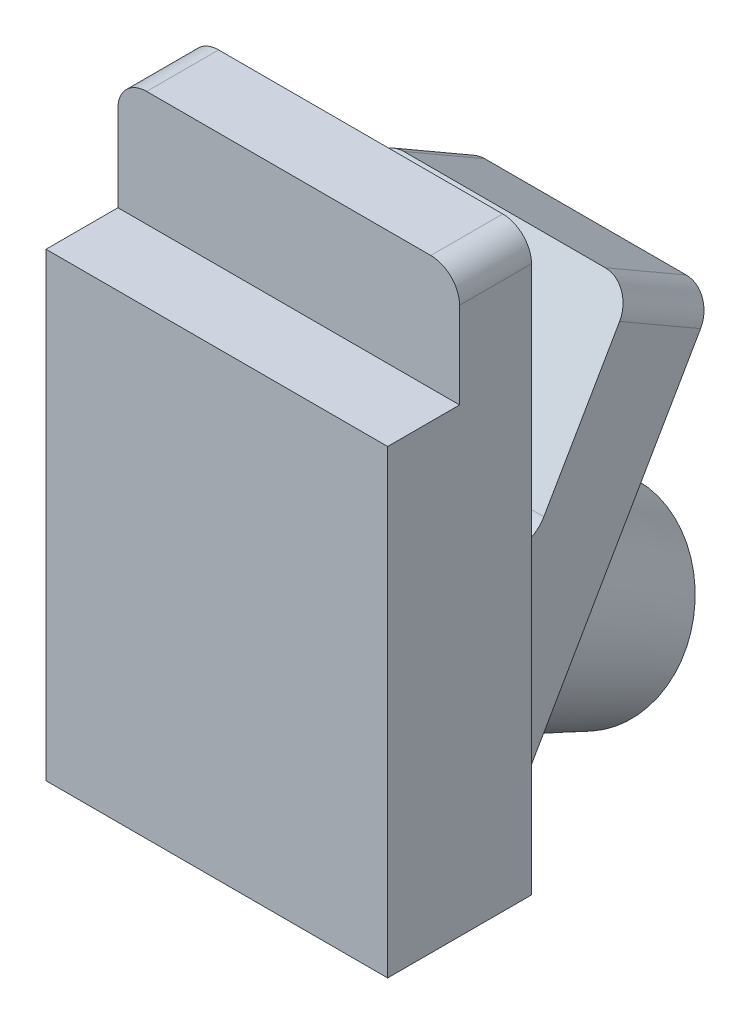
ISO-10303-21;
HEADER;
FILE_DESCRIPTION(('STEP AP214'),'2;1');
FILE_NAME('part.step','',(''),(''),'','','');
FILE_SCHEMA(('AUTOMOTIVE_DESIGN { 1 0 10303 214 1 1 1 1 }'));
ENDSEC;
DATA;
#1=APPLICATION_CONTEXT('core data for automotive mechanical design processes');
#2=APPLICATION_PROTOCOL_DEFINITION('international standard','automotive_design',2000,#1);
#3=PRODUCT_CONTEXT('',#1,'mechanical');
#4=PRODUCT('Part','Part','',(#3));
#5=PRODUCT_RELATED_PRODUCT_CATEGORY('part','',(#4));
#6=PRODUCT_DEFINITION_FORMATION('','',#4);
#7=PRODUCT_DEFINITION_CONTEXT('part definition',#1,'design');
#8=PRODUCT_DEFINITION('design','',#6,#7);
#9=PRODUCT_DEFINITION_SHAPE('','',#8);
#10=(LENGTH_UNIT() NAMED_UNIT(*) SI_UNIT(.MILLI.,.METRE.));
#11=(NAMED_UNIT(*) PLANE_ANGLE_UNIT() SI_UNIT($,.RADIAN.));
#12=(NAMED_UNIT(*) SI_UNIT($,.STERADIAN.) SOLID_ANGLE_UNIT());
#13=UNCERTAINTY_MEASURE_WITH_UNIT(LENGTH_MEASURE(1.E-05),#10,'distance_accuracy_value','');
#14=(GEOMETRIC_REPRESENTATION_CONTEXT(3) GLOBAL_UNCERTAINTY_ASSIGNED_CONTEXT((#13)) GLOBAL_UNIT_ASSIGNED_CONTEXT((#10,
#11,#12)) REPRESENTATION_CONTEXT('',''));
#15=CARTESIAN_POINT('',(0.,0.,0.));
#16=DIRECTION('',(0.,0.,1.));
#17=DIRECTION('',(1.,0.,0.));
#18=AXIS2_PLACEMENT_3D('',#15,#16,#17);
#19=CARTESIAN_POINT('',(-9.,-36.7355485659508,7.16782696905291));
#20=DIRECTION('',(0.,-0.500000000000001,-0.866025403784438));
#21=DIRECTION('',(0.,0.866025403784438,-0.500000000000001));
#22=AXIS2_PLACEMENT_3D('',#19,#20,#21);
#23=PLANE('',#22);
#24=DIRECTION('',(0.,0.866025403784438,-0.500000000000001));
#25=VECTOR('',#24,1.);
#26=CARTESIAN_POINT('',(-9.,-36.7355485659508,7.16782696905291));
#27=LINE('',#26,#25);
#28=CARTESIAN_POINT('',(-9.,-0.535898384862295,-13.7320508075689));
#29=VERTEX_POINT('',#28);
#30=CARTESIAN_POINT('',(-9.,8.59078332763969,-19.0013429510899));
#31=VERTEX_POINT('',#30);
#32=EDGE_CURVE('E242',#29,#31,#27,.T.);
#33=ORIENTED_EDGE('',*,*,#32,.F.);
#34=DIRECTION('',(1.,0.,0.));
#35=VECTOR('',#34,1.);
#36=CARTESIAN_POINT('',(-9.,-0.535898384862295,-13.7320508075689));
#37=LINE('',#36,#35);
#38=CARTESIAN_POINT('',(9.,-0.535898384862295,-13.7320508075689));
#39=VERTEX_POINT('',#38);
#40=EDGE_CURVE('E219',#29,#39,#37,.T.);
#41=ORIENTED_EDGE('',*,*,#40,.T.);
#42=DIRECTION('',(0.,0.866025403784438,-0.500000000000001));
#43=VECTOR('',#42,1.);
#44=CARTESIAN_POINT('',(9.,-36.7355485659508,7.16782696905291));
#45=LINE('',#44,#43);
#46=CARTESIAN_POINT('',(9.,8.59078332763969,-19.0013429510899));
#47=VERTEX_POINT('',#46);
#48=EDGE_CURVE('E251',#39,#47,#45,.T.);
#49=ORIENTED_EDGE('',*,*,#48,.T.);
#50=CARTESIAN_POINT('',(7.,8.59078332763969,-19.0013429510899));
#51=DIRECTION('',(0.,-0.500000000000001,-0.866025403784438));
#52=DIRECTION('',(0.,0.866025403784438,-0.500000000000001));
#53=AXIS2_PLACEMENT_3D('',#50,#51,#52);
#54=CIRCLE('',#53,2.);
#55=CARTESIAN_POINT('',(7.,10.3228341352086,-20.0013429510899));
#56=VERTEX_POINT('',#55);
#57=EDGE_CURVE('E217',#47,#56,#54,.F.);
#58=ORIENTED_EDGE('',*,*,#57,.T.);
#59=DIRECTION('',(1.,0.,0.));
#60=VECTOR('',#59,1.);
#61=CARTESIAN_POINT('',(-9.,10.3228341352086,-20.0013429510899));
#62=LINE('',#61,#60);
#63=CARTESIAN_POINT('',(-7.,10.3228341352086,-20.0013429510899));
#64=VERTEX_POINT('',#63);
#65=EDGE_CURVE('E252',#64,#56,#62,.T.);
#66=ORIENTED_EDGE('',*,*,#65,.F.);
#67=CARTESIAN_POINT('',(-7.,8.59078332763969,-19.0013429510899));
#68=DIRECTION('',(0.,-0.500000000000001,-0.866025403784438));
#69=DIRECTION('',(0.,0.866025403784438,-0.500000000000001));
#70=AXIS2_PLACEMENT_3D('',#67,#68,#69);
#71=CIRCLE('',#70,2.);
#72=EDGE_CURVE('E215',#64,#31,#71,.F.);
#73=ORIENTED_EDGE('',*,*,#72,.T.);
#74=EDGE_LOOP('',(#33,#41,#49,#58,#66,#73));
#75=FACE_BOUND('',#74,.T.);
#76=ADVANCED_FACE('F34',(#75),#23,.F.);
#77=CARTESIAN_POINT('',(9.,-39.9855485659508,1.53866184445407));
#78=DIRECTION('',(-1.,0.,0.));
#79=DIRECTION('',(0.,0.,1.));
#80=AXIS2_PLACEMENT_3D('',#77,#78,#79);
#81=PLANE('',#80);
#82=DIRECTION('',(0.,0.866025403784438,-0.500000000000001));
#83=VECTOR('',#82,1.);
#84=CARTESIAN_POINT('',(9.,-39.9855485659508,1.53866184445407));
#85=LINE('',#84,#83);
#86=CARTESIAN_POINT('',(9.,-20.,-10.));
#87=VERTEX_POINT('',#86);
#88=CARTESIAN_POINT('',(9.,5.34078332763968,-24.6305080756888));
#89=VERTEX_POINT('',#88);
#90=EDGE_CURVE('E261',#87,#89,#85,.T.);
#91=ORIENTED_EDGE('',*,*,#90,.T.);
#92=DIRECTION('',(0.,-0.500000000000001,-0.866025403784438));
#93=VECTOR('',#92,1.);
#94=CARTESIAN_POINT('',(9.,8.59078332763969,-19.0013429510899));
#95=LINE('',#94,#93);
#96=EDGE_CURVE('E234',#89,#47,#95,.F.);
#97=ORIENTED_EDGE('',*,*,#96,.T.);
#98=ORIENTED_EDGE('',*,*,#48,.F.);
#99=CARTESIAN_POINT('',(9.,0.464101615137706,-12.));
#100=DIRECTION('',(-1.,0.,0.));
#101=DIRECTION('',(0.,0.,1.));
#102=AXIS2_PLACEMENT_3D('',#99,#100,#101);
#103=CIRCLE('',#102,2.);
#104=CARTESIAN_POINT('',(9.,0.464101615137706,-10.));
#105=VERTEX_POINT('',#104);
#106=EDGE_CURVE('E237',#39,#105,#103,.T.);
#107=ORIENTED_EDGE('',*,*,#106,.T.);
#108=DIRECTION('',(0.,-1.,0.));
#109=VECTOR('',#108,1.);
#110=CARTESIAN_POINT('',(8.99999999999999,-39.9855485659508,-10.));
#111=LINE('',#110,#109);
#112=EDGE_CURVE('E258',#105,#87,#111,.T.);
#113=ORIENTED_EDGE('',*,*,#112,.T.);
#114=EDGE_LOOP('',(#91,#97,#98,#107,#113));
#115=FACE_BOUND('',#114,.T.);
#116=ADVANCED_FACE('F257',(#115),#81,.F.);
#117=CARTESIAN_POINT('',(-9.,-39.9855485659508,1.53866184445407));
#118=DIRECTION('',(0.,0.500000000000001,0.866025403784438));
#119=DIRECTION('',(0.,-0.866025403784438,0.500000000000001));
#120=AXIS2_PLACEMENT_3D('',#117,#118,#119);
#121=PLANE('',#120);
#122=CARTESIAN_POINT('',(0.,-10.2139129372358,-15.65));
#123=DIRECTION('',(0.,0.500000000000001,0.866025403784438));
#124=DIRECTION('',(0.,-0.866025403784438,0.500000000000001));
#125=AXIS2_PLACEMENT_3D('',#122,#123,#124);
#126=CIRCLE('',#125,7.5);
#127=CARTESIAN_POINT('',(0.,-16.7091034656191,-11.9));
#128=VERTEX_POINT('',#127);
#129=EDGE_CURVE('E11',#128,#128,#126,.F.);
#130=ORIENTED_EDGE('',*,*,#129,.F.);
#131=EDGE_LOOP('',(#130));
#132=FACE_BOUND('',#131,.T.);
#133=DIRECTION('',(-1.,0.,0.));
#134=VECTOR('',#133,1.);
#135=CARTESIAN_POINT('',(9.,7.07283413520856,-25.6305080756888));
#136=LINE('',#135,#134);
#137=CARTESIAN_POINT('',(7.,7.07283413520856,-25.6305080756888));
#138=VERTEX_POINT('',#137);
#139=CARTESIAN_POINT('',(-7.,7.07283413520856,-25.6305080756888));
#140=VERTEX_POINT('',#139);
#141=EDGE_CURVE('E275',#138,#140,#136,.T.);
#142=ORIENTED_EDGE('',*,*,#141,.F.);
#143=CARTESIAN_POINT('',(7.,5.34078332763969,-24.6305080756888));
#144=DIRECTION('',(0.,0.500000000000001,0.866025403784438));
#145=DIRECTION('',(0.,-0.866025403784438,0.500000000000001));
#146=AXIS2_PLACEMENT_3D('',#143,#144,#145);
#147=CIRCLE('',#146,2.);
#148=EDGE_CURVE('E57',#138,#89,#147,.F.);
#149=ORIENTED_EDGE('',*,*,#148,.T.);
#150=ORIENTED_EDGE('',*,*,#90,.F.);
#151=DIRECTION('',(-1.,0.,0.));
#152=VECTOR('',#151,1.);
#153=CARTESIAN_POINT('',(-9.,-20.,-10.));
#154=LINE('',#153,#152);
#155=CARTESIAN_POINT('',(-9.,-20.,-10.));
#156=VERTEX_POINT('',#155);
#157=EDGE_CURVE('E268',#87,#156,#154,.T.);
#158=ORIENTED_EDGE('',*,*,#157,.T.);
#159=DIRECTION('',(0.,0.866025403784438,-0.500000000000001));
#160=VECTOR('',#159,1.);
#161=CARTESIAN_POINT('',(-9.,-39.9855485659508,1.53866184445407));
#162=LINE('',#161,#160);
#163=CARTESIAN_POINT('',(-9.,5.34078332763969,-24.6305080756888));
#164=VERTEX_POINT('',#163);
#165=EDGE_CURVE('E263',#156,#164,#162,.T.);
#166=ORIENTED_EDGE('',*,*,#165,.T.);
#167=CARTESIAN_POINT('',(-7.,5.34078332763969,-24.6305080756888));
#168=DIRECTION('',(0.,0.500000000000001,0.866025403784438));
#169=DIRECTION('',(0.,-0.866025403784438,0.500000000000001));
#170=AXIS2_PLACEMENT_3D('',#167,#168,#169);
#171=CIRCLE('',#170,2.);
#172=EDGE_CURVE('E231',#164,#140,#171,.F.);
#173=ORIENTED_EDGE('',*,*,#172,.T.);
#174=EDGE_LOOP('',(#142,#149,#150,#158,#166,#173));
#175=FACE_BOUND('',#174,.T.);
#176=ADVANCED_FACE('F308',(#132,#175),#121,.F.);
#177=CARTESIAN_POINT('',(-9.,-39.9855485659508,1.53866184445407));
#178=DIRECTION('',(1.,0.,0.));
#179=DIRECTION('',(0.,0.,-1.));
#180=AXIS2_PLACEMENT_3D('',#177,#178,#179);
#181=PLANE('',#180);
#182=ORIENTED_EDGE('',*,*,#32,.T.);
#183=DIRECTION('',(0.,0.500000000000001,0.866025403784438));
#184=VECTOR('',#183,1.);
#185=CARTESIAN_POINT('',(-9.,5.34078332763969,-24.6305080756888));
#186=LINE('',#185,#184);
#187=EDGE_CURVE('E49',#31,#164,#186,.F.);
#188=ORIENTED_EDGE('',*,*,#187,.T.);
#189=ORIENTED_EDGE('',*,*,#165,.F.);
#190=DIRECTION('',(0.,1.,0.));
#191=VECTOR('',#190,1.);
#192=CARTESIAN_POINT('',(-8.99999999999999,-39.9855485659508,-10.));
#193=LINE('',#192,#191);
#194=CARTESIAN_POINT('',(-9.,0.464101615137706,-10.));
#195=VERTEX_POINT('',#194);
#196=EDGE_CURVE('E243',#156,#195,#193,.T.);
#197=ORIENTED_EDGE('',*,*,#196,.T.);
#198=CARTESIAN_POINT('',(-9.,0.464101615137706,-12.));
#199=DIRECTION('',(1.,0.,0.));
#200=DIRECTION('',(0.,0.,-1.));
#201=AXIS2_PLACEMENT_3D('',#198,#199,#200);
#202=CIRCLE('',#201,2.);
#203=EDGE_CURVE('E42',#195,#29,#202,.T.);
#204=ORIENTED_EDGE('',*,*,#203,.T.);
#205=EDGE_LOOP('',(#182,#188,#189,#197,#204));
#206=FACE_BOUND('',#205,.T.);
#207=ADVANCED_FACE('F241',(#206),#181,.F.);
#208=CARTESIAN_POINT('',(11.875,20.,-10.));
#209=DIRECTION('',(0.,1.,0.));
#210=DIRECTION('',(0.,0.,1.));
#211=AXIS2_PLACEMENT_3D('',#208,#209,#210);
#212=PLANE('',#211);
#213=DIRECTION('',(-1.,0.,0.));
#214=VECTOR('',#213,1.);
#215=CARTESIAN_POINT('',(-11.875,20.,-5.));
#216=LINE('',#215,#214);
#217=CARTESIAN_POINT('',(9.875,20.,-5.));
#218=VERTEX_POINT('',#217);
#219=CARTESIAN_POINT('',(-9.875,20.,-5.));
#220=VERTEX_POINT('',#219);
#221=EDGE_CURVE('E169',#218,#220,#216,.T.);
#222=ORIENTED_EDGE('',*,*,#221,.F.);
#223=DIRECTION('',(0.,0.,1.));
#224=VECTOR('',#223,1.);
#225=CARTESIAN_POINT('',(9.875,20.,-10.));
#226=LINE('',#225,#224);
#227=CARTESIAN_POINT('',(9.875,20.,-10.));
#228=VERTEX_POINT('',#227);
#229=EDGE_CURVE('E207',#218,#228,#226,.F.);
#230=ORIENTED_EDGE('',*,*,#229,.T.);
#231=DIRECTION('',(-1.,0.,0.));
#232=VECTOR('',#231,1.);
#233=CARTESIAN_POINT('',(11.875,20.,-10.));
#234=LINE('',#233,#232);
#235=CARTESIAN_POINT('',(-9.875,20.,-10.));
#236=VERTEX_POINT('',#235);
#237=EDGE_CURVE('E185',#228,#236,#234,.T.);
#238=ORIENTED_EDGE('',*,*,#237,.T.);
#239=DIRECTION('',(0.,0.,1.));
#240=VECTOR('',#239,1.);
#241=CARTESIAN_POINT('',(-9.875,20.,-10.));
#242=LINE('',#241,#240);
#243=EDGE_CURVE('E204',#236,#220,#242,.T.);
#244=ORIENTED_EDGE('',*,*,#243,.T.);
#245=EDGE_LOOP('',(#222,#230,#238,#244));
#246=FACE_BOUND('',#245,.T.);
#247=ADVANCED_FACE('F319',(#246),#212,.T.);
#248=CARTESIAN_POINT('',(-11.875,20.,-10.));
#249=DIRECTION('',(-1.,0.,0.));
#250=DIRECTION('',(0.,-1.,0.));
#251=AXIS2_PLACEMENT_3D('',#248,#249,#250);
#252=PLANE('',#251);
#253=DIRECTION('',(0.,-1.,0.));
#254=VECTOR('',#253,1.);
#255=CARTESIAN_POINT('',(-11.875,20.,-5.));
#256=LINE('',#255,#254);
#257=CARTESIAN_POINT('',(-11.875,18.,-5.));
#258=VERTEX_POINT('',#257);
#259=CARTESIAN_POINT('',(-11.875,12.,-5.));
#260=VERTEX_POINT('',#259);
#261=EDGE_CURVE('E144',#258,#260,#256,.T.);
#262=ORIENTED_EDGE('',*,*,#261,.F.);
#263=DIRECTION('',(0.,0.,1.));
#264=VECTOR('',#263,1.);
#265=CARTESIAN_POINT('',(-11.875,18.,-10.));
#266=LINE('',#265,#264);
#267=CARTESIAN_POINT('',(-11.875,18.,-10.));
#268=VERTEX_POINT('',#267);
#269=EDGE_CURVE('E213',#258,#268,#266,.F.);
#270=ORIENTED_EDGE('',*,*,#269,.T.);
#271=DIRECTION('',(0.,-1.,0.));
#272=VECTOR('',#271,1.);
#273=CARTESIAN_POINT('',(-11.875,20.,-10.));
#274=LINE('',#273,#272);
#275=CARTESIAN_POINT('',(-11.875,-20.,-10.));
#276=VERTEX_POINT('',#275);
#277=EDGE_CURVE('E175',#268,#276,#274,.T.);
#278=ORIENTED_EDGE('',*,*,#277,.T.);
#279=DIRECTION('',(0.,0.,1.));
#280=VECTOR('',#279,1.);
#281=CARTESIAN_POINT('',(-11.875,-20.,-10.));
#282=LINE('',#281,#280);
#283=CARTESIAN_POINT('',(-11.875,-20.,0.));
#284=VERTEX_POINT('',#283);
#285=EDGE_CURVE('E188',#276,#284,#282,.T.);
#286=ORIENTED_EDGE('',*,*,#285,.T.);
#287=DIRECTION('',(0.,-1.,0.));
#288=VECTOR('',#287,1.);
#289=CARTESIAN_POINT('',(-11.875,20.,0.));
#290=LINE('',#289,#288);
#291=CARTESIAN_POINT('',(-11.875,12.,0.));
#292=VERTEX_POINT('',#291);
#293=EDGE_CURVE('E168',#292,#284,#290,.T.);
#294=ORIENTED_EDGE('',*,*,#293,.F.);
#295=DIRECTION('',(0.,0.,1.));
#296=VECTOR('',#295,1.);
#297=CARTESIAN_POINT('',(-11.875,12.,-5.));
#298=LINE('',#297,#296);
#299=EDGE_CURVE('E159',#260,#292,#298,.T.);
#300=ORIENTED_EDGE('',*,*,#299,.F.);
#301=EDGE_LOOP('',(#262,#270,#278,#286,#294,#300));
#302=FACE_BOUND('',#301,.T.);
#303=ADVANCED_FACE('F166',(#302),#252,.T.);
#304=CARTESIAN_POINT('',(11.875,20.,-10.));
#305=DIRECTION('',(1.,0.,0.));
#306=DIRECTION('',(0.,1.,0.));
#307=AXIS2_PLACEMENT_3D('',#304,#305,#306);
#308=PLANE('',#307);
#309=DIRECTION('',(0.,1.,0.));
#310=VECTOR('',#309,1.);
#311=CARTESIAN_POINT('',(11.875,20.,-10.));
#312=LINE('',#311,#310);
#313=CARTESIAN_POINT('',(11.875,-20.,-10.));
#314=VERTEX_POINT('',#313);
#315=CARTESIAN_POINT('',(11.875,18.,-10.));
#316=VERTEX_POINT('',#315);
#317=EDGE_CURVE('E182',#314,#316,#312,.T.);
#318=ORIENTED_EDGE('',*,*,#317,.T.);
#319=DIRECTION('',(0.,0.,1.));
#320=VECTOR('',#319,1.);
#321=CARTESIAN_POINT('',(11.875,18.,-10.));
#322=LINE('',#321,#320);
#323=CARTESIAN_POINT('',(11.875,18.,-5.));
#324=VERTEX_POINT('',#323);
#325=EDGE_CURVE('E197',#316,#324,#322,.T.);
#326=ORIENTED_EDGE('',*,*,#325,.T.);
#327=DIRECTION('',(0.,1.,0.));
#328=VECTOR('',#327,1.);
#329=CARTESIAN_POINT('',(11.875,20.,-5.));
#330=LINE('',#329,#328);
#331=CARTESIAN_POINT('',(11.875,12.,-5.));
#332=VERTEX_POINT('',#331);
#333=EDGE_CURVE('E163',#332,#324,#330,.T.);
#334=ORIENTED_EDGE('',*,*,#333,.F.);
#335=DIRECTION('',(0.,0.,1.));
#336=VECTOR('',#335,1.);
#337=CARTESIAN_POINT('',(11.875,12.,-5.));
#338=LINE('',#337,#336);
#339=CARTESIAN_POINT('',(11.875,12.,0.));
#340=VERTEX_POINT('',#339);
#341=EDGE_CURVE('E162',#332,#340,#338,.T.);
#342=ORIENTED_EDGE('',*,*,#341,.T.);
#343=DIRECTION('',(0.,1.,0.));
#344=VECTOR('',#343,1.);
#345=CARTESIAN_POINT('',(11.875,20.,0.));
#346=LINE('',#345,#344);
#347=CARTESIAN_POINT('',(11.875,-20.,0.));
#348=VERTEX_POINT('',#347);
#349=EDGE_CURVE('E178',#348,#340,#346,.T.);
#350=ORIENTED_EDGE('',*,*,#349,.F.);
#351=DIRECTION('',(0.,0.,1.));
#352=VECTOR('',#351,1.);
#353=CARTESIAN_POINT('',(11.875,-20.,-10.));
#354=LINE('',#353,#352);
#355=EDGE_CURVE('E195',#314,#348,#354,.T.);
#356=ORIENTED_EDGE('',*,*,#355,.F.);
#357=EDGE_LOOP('',(#318,#326,#334,#342,#350,#356));
#358=FACE_BOUND('',#357,.T.);
#359=ADVANCED_FACE('F337',(#358),#308,.T.);
#360=CARTESIAN_POINT('',(11.875,-20.,-10.));
#361=DIRECTION('',(0.,-1.,0.));
#362=DIRECTION('',(0.,0.,-1.));
#363=AXIS2_PLACEMENT_3D('',#360,#361,#362);
#364=PLANE('',#363);
#365=DIRECTION('',(1.,0.,0.));
#366=VECTOR('',#365,1.);
#367=CARTESIAN_POINT('',(11.875,-20.,0.));
#368=LINE('',#367,#366);
#369=EDGE_CURVE('E190',#284,#348,#368,.T.);
#370=ORIENTED_EDGE('',*,*,#369,.F.);
#371=ORIENTED_EDGE('',*,*,#285,.F.);
#372=DIRECTION('',(1.,0.,0.));
#373=VECTOR('',#372,1.);
#374=CARTESIAN_POINT('',(11.875,-20.,-10.));
#375=LINE('',#374,#373);
#376=EDGE_CURVE('E179',#276,#156,#375,.T.);
#377=ORIENTED_EDGE('',*,*,#376,.T.);
#378=ORIENTED_EDGE('',*,*,#157,.F.);
#379=EDGE_CURVE('E177',#87,#314,#375,.T.);
#380=ORIENTED_EDGE('',*,*,#379,.T.);
#381=ORIENTED_EDGE('',*,*,#355,.T.);
#382=EDGE_LOOP('',(#370,#371,#377,#378,#380,#381));
#383=FACE_BOUND('',#382,.T.);
#384=ADVANCED_FACE('F329',(#383),#364,.T.);
#385=CARTESIAN_POINT('',(0.,0.,-10.));
#386=DIRECTION('',(0.,0.,-1.));
#387=DIRECTION('',(-1.,0.,0.));
#388=AXIS2_PLACEMENT_3D('',#385,#386,#387);
#389=PLANE('',#388);
#390=ORIENTED_EDGE('',*,*,#112,.F.);
#391=DIRECTION('',(1.,0.,0.));
#392=VECTOR('',#391,1.);
#393=CARTESIAN_POINT('',(0.,0.464101615137706,-10.));
#394=LINE('',#393,#392);
#395=EDGE_CURVE('E222',#105,#195,#394,.F.);
#396=ORIENTED_EDGE('',*,*,#395,.T.);
#397=ORIENTED_EDGE('',*,*,#196,.F.);
#398=ORIENTED_EDGE('',*,*,#376,.F.);
#399=ORIENTED_EDGE('',*,*,#277,.F.);
#400=CARTESIAN_POINT('',(-9.875,18.,-10.));
#401=DIRECTION('',(0.,0.,-1.));
#402=DIRECTION('',(-1.,0.,0.));
#403=AXIS2_PLACEMENT_3D('',#400,#401,#402);
#404=CIRCLE('',#403,2.);
#405=EDGE_CURVE('E209',#268,#236,#404,.T.);
#406=ORIENTED_EDGE('',*,*,#405,.T.);
#407=ORIENTED_EDGE('',*,*,#237,.F.);
#408=CARTESIAN_POINT('',(9.875,18.,-10.));
#409=DIRECTION('',(0.,0.,-1.));
#410=DIRECTION('',(-1.,0.,0.));
#411=AXIS2_PLACEMENT_3D('',#408,#409,#410);
#412=CIRCLE('',#411,2.);
#413=EDGE_CURVE('E211',#228,#316,#412,.T.);
#414=ORIENTED_EDGE('',*,*,#413,.T.);
#415=ORIENTED_EDGE('',*,*,#317,.F.);
#416=ORIENTED_EDGE('',*,*,#379,.F.);
#417=EDGE_LOOP('',(#390,#396,#397,#398,#399,#406,#407,#414,#415,#416));
#418=FACE_BOUND('',#417,.T.);
#419=ADVANCED_FACE('F326',(#418),#389,.T.);
#420=CARTESIAN_POINT('',(0.,0.,0.));
#421=DIRECTION('',(0.,0.,-1.));
#422=DIRECTION('',(-1.,0.,0.));
#423=AXIS2_PLACEMENT_3D('',#420,#421,#422);
#424=PLANE('',#423);
#425=ORIENTED_EDGE('',*,*,#349,.T.);
#426=DIRECTION('',(1.,0.,0.));
#427=VECTOR('',#426,1.);
#428=CARTESIAN_POINT('',(-11.875,12.,0.));
#429=LINE('',#428,#427);
#430=EDGE_CURVE('E155',#292,#340,#429,.T.);
#431=ORIENTED_EDGE('',*,*,#430,.F.);
#432=ORIENTED_EDGE('',*,*,#293,.T.);
#433=ORIENTED_EDGE('',*,*,#369,.T.);
#434=EDGE_LOOP('',(#425,#431,#432,#433));
#435=FACE_BOUND('',#434,.T.);
#436=ADVANCED_FACE('F325',(#435),#424,.F.);
#437=CARTESIAN_POINT('',(-11.875,12.,-5.));
#438=DIRECTION('',(0.,-1.,0.));
#439=DIRECTION('',(1.,0.,0.));
#440=AXIS2_PLACEMENT_3D('',#437,#438,#439);
#441=PLANE('',#440);
#442=ORIENTED_EDGE('',*,*,#430,.T.);
#443=ORIENTED_EDGE('',*,*,#341,.F.);
#444=DIRECTION('',(1.,0.,0.));
#445=VECTOR('',#444,1.);
#446=CARTESIAN_POINT('',(-11.875,12.,-5.));
#447=LINE('',#446,#445);
#448=EDGE_CURVE('E148',#260,#332,#447,.T.);
#449=ORIENTED_EDGE('',*,*,#448,.F.);
#450=ORIENTED_EDGE('',*,*,#299,.T.);
#451=EDGE_LOOP('',(#442,#443,#449,#450));
#452=FACE_BOUND('',#451,.T.);
#453=ADVANCED_FACE('F158',(#452),#441,.F.);
#454=CARTESIAN_POINT('',(0.,0.,-5.));
#455=DIRECTION('',(0.,0.,1.));
#456=DIRECTION('',(1.,0.,0.));
#457=AXIS2_PLACEMENT_3D('',#454,#455,#456);
#458=PLANE('',#457);
#459=ORIENTED_EDGE('',*,*,#333,.T.);
#460=CARTESIAN_POINT('',(9.875,18.,-5.));
#461=DIRECTION('',(0.,0.,1.));
#462=DIRECTION('',(1.,0.,0.));
#463=AXIS2_PLACEMENT_3D('',#460,#461,#462);
#464=CIRCLE('',#463,2.);
#465=EDGE_CURVE('E202',#324,#218,#464,.T.);
#466=ORIENTED_EDGE('',*,*,#465,.T.);
#467=ORIENTED_EDGE('',*,*,#221,.T.);
#468=CARTESIAN_POINT('',(-9.875,18.,-5.));
#469=DIRECTION('',(0.,0.,1.));
#470=DIRECTION('',(1.,0.,0.));
#471=AXIS2_PLACEMENT_3D('',#468,#469,#470);
#472=CIRCLE('',#471,2.);
#473=EDGE_CURVE('E151',#220,#258,#472,.T.);
#474=ORIENTED_EDGE('',*,*,#473,.T.);
#475=ORIENTED_EDGE('',*,*,#261,.T.);
#476=ORIENTED_EDGE('',*,*,#448,.T.);
#477=EDGE_LOOP('',(#459,#466,#467,#474,#475,#476));
#478=FACE_BOUND('',#477,.T.);
#479=ADVANCED_FACE('F147',(#478),#458,.T.);
#480=CARTESIAN_POINT('',(9.875,18.,-10.));
#481=DIRECTION('',(0.,0.,1.));
#482=DIRECTION('',(1.,0.,0.));
#483=AXIS2_PLACEMENT_3D('',#480,#481,#482);
#484=CYLINDRICAL_SURFACE('',#483,2.);
#485=ORIENTED_EDGE('',*,*,#413,.F.);
#486=ORIENTED_EDGE('',*,*,#229,.F.);
#487=ORIENTED_EDGE('',*,*,#465,.F.);
#488=ORIENTED_EDGE('',*,*,#325,.F.);
#489=EDGE_LOOP('',(#485,#486,#487,#488));
#490=FACE_BOUND('',#489,.T.);
#491=ADVANCED_FACE('F322',(#490),#484,.T.);
#492=CARTESIAN_POINT('',(-9.875,18.,-10.));
#493=DIRECTION('',(0.,0.,1.));
#494=DIRECTION('',(1.,0.,0.));
#495=AXIS2_PLACEMENT_3D('',#492,#493,#494);
#496=CYLINDRICAL_SURFACE('',#495,2.);
#497=ORIENTED_EDGE('',*,*,#405,.F.);
#498=ORIENTED_EDGE('',*,*,#269,.F.);
#499=ORIENTED_EDGE('',*,*,#473,.F.);
#500=ORIENTED_EDGE('',*,*,#243,.F.);
#501=EDGE_LOOP('',(#497,#498,#499,#500));
#502=FACE_BOUND('',#501,.T.);
#503=ADVANCED_FACE('F348',(#502),#496,.T.);
#504=CARTESIAN_POINT('',(0.,16.4029611541308,-9.47025403784441));
#505=DIRECTION('',(0.,0.866025403784438,-0.500000000000001));
#506=DIRECTION('',(0.,0.500000000000001,0.866025403784438));
#507=AXIS2_PLACEMENT_3D('',#504,#505,#506);
#508=PLANE('',#507);
#509=ORIENTED_EDGE('',*,*,#65,.T.);
#510=DIRECTION('',(0.,-0.500000000000001,-0.866025403784438));
#511=VECTOR('',#510,1.);
#512=CARTESIAN_POINT('',(7.,7.07283413520856,-25.6305080756888));
#513=LINE('',#512,#511);
#514=EDGE_CURVE('E228',#56,#138,#513,.T.);
#515=ORIENTED_EDGE('',*,*,#514,.T.);
#516=ORIENTED_EDGE('',*,*,#141,.T.);
#517=DIRECTION('',(0.,0.500000000000001,0.866025403784438));
#518=VECTOR('',#517,1.);
#519=CARTESIAN_POINT('',(-7.,10.3228341352086,-20.0013429510899));
#520=LINE('',#519,#518);
#521=EDGE_CURVE('E225',#140,#64,#520,.T.);
#522=ORIENTED_EDGE('',*,*,#521,.T.);
#523=EDGE_LOOP('',(#509,#515,#516,#522));
#524=FACE_BOUND('',#523,.T.);
#525=ADVANCED_FACE('F311',(#524),#508,.T.);
#526=CARTESIAN_POINT('',(-9.,0.464101615137706,-12.));
#527=DIRECTION('',(1.,0.,0.));
#528=DIRECTION('',(0.,0.,-1.));
#529=AXIS2_PLACEMENT_3D('',#526,#527,#528);
#530=CYLINDRICAL_SURFACE('',#529,2.);
#531=ORIENTED_EDGE('',*,*,#203,.F.);
#532=ORIENTED_EDGE('',*,*,#395,.F.);
#533=ORIENTED_EDGE('',*,*,#106,.F.);
#534=ORIENTED_EDGE('',*,*,#40,.F.);
#535=EDGE_LOOP('',(#531,#532,#533,#534));
#536=FACE_BOUND('',#535,.T.);
#537=ADVANCED_FACE('F254',(#536),#530,.F.);
#538=CARTESIAN_POINT('',(7.00000000000001,14.6709103465619,-8.47025403784441));
#539=DIRECTION('',(0.,0.500000000000001,0.866025403784438));
#540=DIRECTION('',(0.,-0.866025403784438,0.500000000000001));
#541=AXIS2_PLACEMENT_3D('',#538,#539,#540);
#542=CYLINDRICAL_SURFACE('',#541,2.);
#543=ORIENTED_EDGE('',*,*,#57,.F.);
#544=ORIENTED_EDGE('',*,*,#96,.F.);
#545=ORIENTED_EDGE('',*,*,#148,.F.);
#546=ORIENTED_EDGE('',*,*,#514,.F.);
#547=EDGE_LOOP('',(#543,#544,#545,#546));
#548=FACE_BOUND('',#547,.T.);
#549=ADVANCED_FACE('F354',(#548),#542,.T.);
#550=CARTESIAN_POINT('',(-7.00000000000001,14.6709103465619,-8.47025403784441));
#551=DIRECTION('',(0.,-0.500000000000001,-0.866025403784438));
#552=DIRECTION('',(0.,0.866025403784438,-0.500000000000001));
#553=AXIS2_PLACEMENT_3D('',#550,#551,#552);
#554=CYLINDRICAL_SURFACE('',#553,2.);
#555=ORIENTED_EDGE('',*,*,#172,.F.);
#556=ORIENTED_EDGE('',*,*,#187,.F.);
#557=ORIENTED_EDGE('',*,*,#72,.F.);
#558=ORIENTED_EDGE('',*,*,#521,.F.);
#559=EDGE_LOOP('',(#555,#556,#557,#558));
#560=FACE_BOUND('',#559,.T.);
#561=ADVANCED_FACE('F36',(#560),#554,.T.);
#562=CARTESIAN_POINT('',(0.,-10.2139129372358,-15.65));
#563=DIRECTION('',(0.,0.500000000000001,0.866025403784438));
#564=DIRECTION('',(0.,0.866025403784438,-0.500000000000001));
#565=AXIS2_PLACEMENT_3D('',#562,#563,#564);
#566=CONICAL_SURFACE('',#565,7.5,0.0872664625997167);
#567=CARTESIAN_POINT('',(0.,-16.2139129372359,-26.0423048454133));
#568=DIRECTION('',(0.,-0.500000000000001,-0.866025403784438));
#569=DIRECTION('',(0.,0.866025403784438,-0.500000000000001));
#570=AXIS2_PLACEMENT_3D('',#567,#568,#569);
#571=CIRCLE('',#570,6.45013603768891);
#572=CARTESIAN_POINT('',(0.,-10.6279312707318,-29.2673728642577));
#573=VERTEX_POINT('',#572);
#574=EDGE_CURVE('E278',#573,#573,#571,.T.);
#575=ORIENTED_EDGE('',*,*,#574,.F.);
#576=EDGE_LOOP('',(#575));
#577=FACE_BOUND('',#576,.T.);
#578=ORIENTED_EDGE('',*,*,#129,.T.);
#579=EDGE_LOOP('',(#578));
#580=FACE_BOUND('',#579,.T.);
#581=ADVANCED_FACE('F300',(#577,#580),#566,.T.);
#582=CARTESIAN_POINT('',(0.,-16.2139129372359,-26.0423048454133));
#583=DIRECTION('',(0.,-0.500000000000001,-0.866025403784438));
#584=DIRECTION('',(0.,0.866025403784438,-0.500000000000001));
#585=AXIS2_PLACEMENT_3D('',#582,#583,#584);
#586=PLANE('',#585);
#587=CARTESIAN_POINT('',(0.,-16.2139129372359,-26.0423048454133));
#588=DIRECTION('',(0.,-0.500000000000001,-0.866025403784438));
#589=DIRECTION('',(0.,0.866025403784438,-0.500000000000001));
#590=AXIS2_PLACEMENT_3D('',#587,#588,#589);
#591=CIRCLE('',#590,6.0498639623111);
#592=CARTESIAN_POINT('',(0.,-10.9745770564345,-29.0672368265688));
#593=VERTEX_POINT('',#592);
#594=EDGE_CURVE('E281',#593,#593,#591,.T.);
#595=ORIENTED_EDGE('',*,*,#594,.F.);
#596=EDGE_LOOP('',(#595));
#597=FACE_BOUND('',#596,.T.);
#598=ORIENTED_EDGE('',*,*,#574,.T.);
#599=EDGE_LOOP('',(#598));
#600=FACE_BOUND('',#599,.T.);
#601=ADVANCED_FACE('F292',(#597,#600),#586,.T.);
#602=CARTESIAN_POINT('',(0.,-10.2139129372359,-15.65));
#603=DIRECTION('',(0.,-0.500000000000001,-0.866025403784438));
#604=DIRECTION('',(0.,0.866025403784438,-0.500000000000001));
#605=AXIS2_PLACEMENT_3D('',#602,#603,#604);
#606=CONICAL_SURFACE('',#605,5.,0.0872664625997167);
#607=ORIENTED_EDGE('',*,*,#594,.T.);
#608=EDGE_LOOP('',(#607));
#609=FACE_BOUND('',#608,.T.);
#610=CARTESIAN_POINT('',(0.,-10.2139129372359,-15.65));
#611=DIRECTION('',(0.,-0.500000000000001,-0.866025403784438));
#612=DIRECTION('',(0.,0.866025403784438,-0.500000000000001));
#613=AXIS2_PLACEMENT_3D('',#610,#611,#612);
#614=CIRCLE('',#613,5.);
#615=CARTESIAN_POINT('',(0.,-5.88378591831366,-18.15));
#616=VERTEX_POINT('',#615);
#617=EDGE_CURVE('E284',#616,#616,#614,.T.);
#618=ORIENTED_EDGE('',*,*,#617,.F.);
#619=EDGE_LOOP('',(#618));
#620=FACE_BOUND('',#619,.T.);
#621=ADVANCED_FACE('F290',(#609,#620),#606,.F.);
#622=CARTESIAN_POINT('',(0.,-10.2139129372359,-15.65));
#623=DIRECTION('',(0.,-0.500000000000001,-0.866025403784438));
#624=DIRECTION('',(0.,0.866025403784438,-0.500000000000001));
#625=AXIS2_PLACEMENT_3D('',#622,#623,#624);
#626=PLANE('',#625);
#627=ORIENTED_EDGE('',*,*,#617,.T.);
#628=EDGE_LOOP('',(#627));
#629=FACE_BOUND('',#628,.T.);
#630=ADVANCED_FACE('F288',(#629),#626,.T.);
#631=CLOSED_SHELL('',(#76,#116,#176,#207,#247,#303,#359,#384,#419,#436,#453,#479,#491,#503,#525,
#537,#549,#561,#581,#601,#621,#630));
#632=MANIFOLD_SOLID_BREP('B2',#631);
#633=ADVANCED_BREP_SHAPE_REPRESENTATION('',(#18,#632),#14);
#634=SHAPE_DEFINITION_REPRESENTATION(#9,#633);
ENDSEC;
END-ISO-10303-21;
